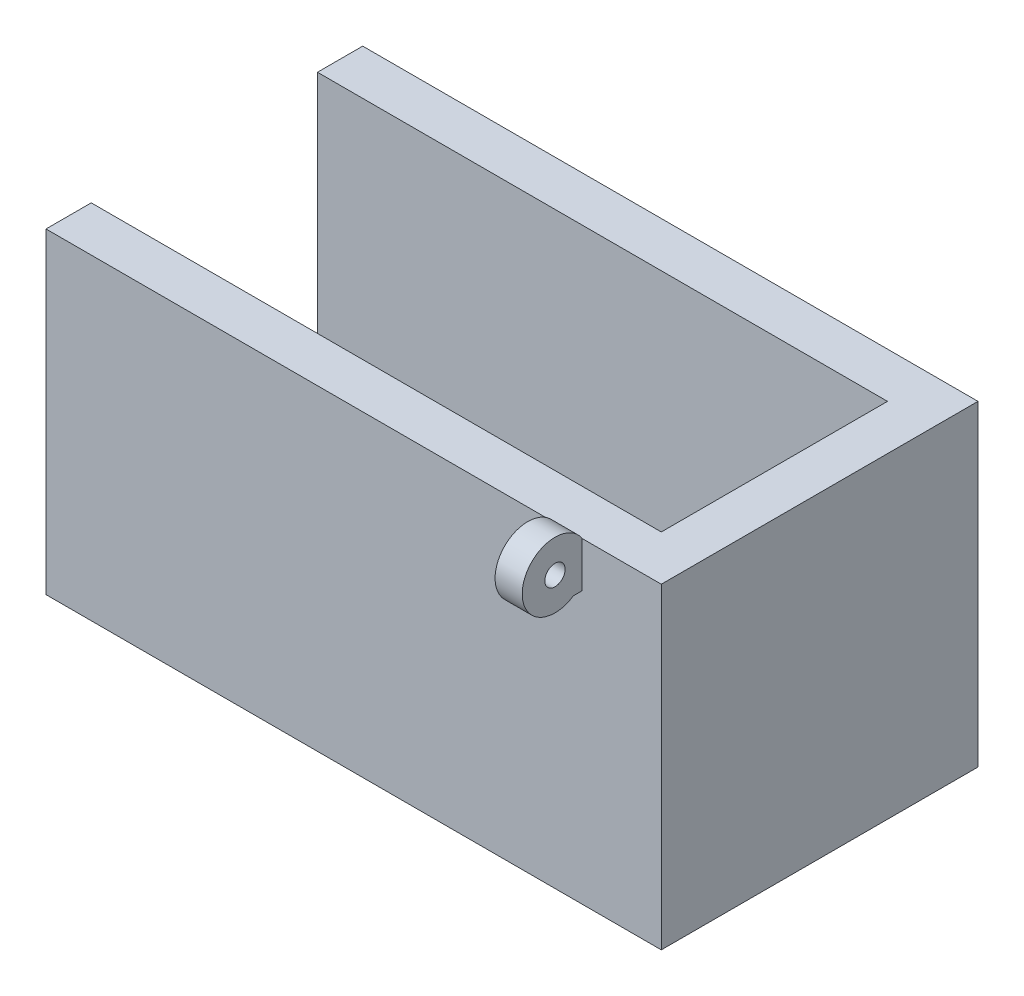
ISO-10303-21;
HEADER;
FILE_DESCRIPTION(('STEP AP214'),'2;1');
FILE_NAME('part.step','',(''),(''),'','','');
FILE_SCHEMA(('AUTOMOTIVE_DESIGN { 1 0 10303 214 1 1 1 1 }'));
ENDSEC;
DATA;
#1=APPLICATION_CONTEXT('core data for automotive mechanical design processes');
#2=APPLICATION_PROTOCOL_DEFINITION('international standard','automotive_design',2000,#1);
#3=PRODUCT_CONTEXT('',#1,'mechanical');
#4=PRODUCT('Part','Part','',(#3));
#5=PRODUCT_RELATED_PRODUCT_CATEGORY('part','',(#4));
#6=PRODUCT_DEFINITION_FORMATION('','',#4);
#7=PRODUCT_DEFINITION_CONTEXT('part definition',#1,'design');
#8=PRODUCT_DEFINITION('design','',#6,#7);
#9=PRODUCT_DEFINITION_SHAPE('','',#8);
#10=(LENGTH_UNIT() NAMED_UNIT(*) SI_UNIT(.MILLI.,.METRE.));
#11=(NAMED_UNIT(*) PLANE_ANGLE_UNIT() SI_UNIT($,.RADIAN.));
#12=(NAMED_UNIT(*) SI_UNIT($,.STERADIAN.) SOLID_ANGLE_UNIT());
#13=UNCERTAINTY_MEASURE_WITH_UNIT(LENGTH_MEASURE(1.E-05),#10,'distance_accuracy_value','');
#14=(GEOMETRIC_REPRESENTATION_CONTEXT(3) GLOBAL_UNCERTAINTY_ASSIGNED_CONTEXT((#13)) GLOBAL_UNIT_ASSIGNED_CONTEXT((#10,
#11,#12)) REPRESENTATION_CONTEXT('',''));
#15=CARTESIAN_POINT('',(0.,0.,0.));
#16=DIRECTION('',(0.,0.,1.));
#17=DIRECTION('',(1.,0.,0.));
#18=AXIS2_PLACEMENT_3D('',#15,#16,#17);
#19=CARTESIAN_POINT('',(-109.463414634146,140.,77.3902439024391));
#20=DIRECTION('',(0.,0.,-1.));
#21=DIRECTION('',(-1.,0.,0.));
#22=AXIS2_PLACEMENT_3D('',#19,#20,#21);
#23=PLANE('',#22);
#24=DIRECTION('',(0.,-1.,0.));
#25=VECTOR('',#24,1.);
#26=CARTESIAN_POINT('',(115.536585365854,132.,77.3902439024391));
#27=LINE('',#26,#25);
#28=CARTESIAN_POINT('',(115.536585365854,140.,77.3902439024391));
#29=VERTEX_POINT('',#28);
#30=CARTESIAN_POINT('',(115.536585365854,120.,77.3902439024391));
#31=VERTEX_POINT('',#30);
#32=EDGE_CURVE('E304',#29,#31,#27,.T.);
#33=ORIENTED_EDGE('',*,*,#32,.F.);
#34=DIRECTION('',(1.,0.,0.));
#35=VECTOR('',#34,1.);
#36=CARTESIAN_POINT('',(-109.463414634146,140.,77.3902439024391));
#37=LINE('',#36,#35);
#38=CARTESIAN_POINT('',(-109.463414634146,140.,77.3902439024391));
#39=VERTEX_POINT('',#38);
#40=EDGE_CURVE('E259',#39,#29,#37,.T.);
#41=ORIENTED_EDGE('',*,*,#40,.F.);
#42=DIRECTION('',(0.,-1.,0.));
#43=VECTOR('',#42,1.);
#44=CARTESIAN_POINT('',(-109.463414634146,140.,77.3902439024391));
#45=LINE('',#44,#43);
#46=CARTESIAN_POINT('',(-109.463414634146,0.,77.3902439024391));
#47=VERTEX_POINT('',#46);
#48=EDGE_CURVE('E12',#39,#47,#45,.T.);
#49=ORIENTED_EDGE('',*,*,#48,.T.);
#50=DIRECTION('',(1.,0.,0.));
#51=VECTOR('',#50,1.);
#52=CARTESIAN_POINT('',(-109.463414634146,0.,77.3902439024391));
#53=LINE('',#52,#51);
#54=CARTESIAN_POINT('',(162.536585365854,0.,77.3902439024391));
#55=VERTEX_POINT('',#54);
#56=EDGE_CURVE('E268',#47,#55,#53,.T.);
#57=ORIENTED_EDGE('',*,*,#56,.T.);
#58=DIRECTION('',(0.,-1.,0.));
#59=VECTOR('',#58,1.);
#60=CARTESIAN_POINT('',(162.536585365854,140.,77.3902439024391));
#61=LINE('',#60,#59);
#62=CARTESIAN_POINT('',(162.536585365854,140.,77.3902439024391));
#63=VERTEX_POINT('',#62);
#64=EDGE_CURVE('E48',#63,#55,#61,.T.);
#65=ORIENTED_EDGE('',*,*,#64,.F.);
#66=CARTESIAN_POINT('',(127.536585365854,140.,77.3902439024391));
#67=VERTEX_POINT('',#66);
#68=EDGE_CURVE('E257',#67,#63,#37,.T.);
#69=ORIENTED_EDGE('',*,*,#68,.F.);
#70=DIRECTION('',(0.,1.,0.));
#71=VECTOR('',#70,1.);
#72=CARTESIAN_POINT('',(127.536585365854,132.,77.3902439024391));
#73=LINE('',#72,#71);
#74=CARTESIAN_POINT('',(127.536585365854,120.,77.3902439024391));
#75=VERTEX_POINT('',#74);
#76=EDGE_CURVE('E177',#75,#67,#73,.T.);
#77=ORIENTED_EDGE('',*,*,#76,.F.);
#78=DIRECTION('',(1.,0.,0.));
#79=VECTOR('',#78,1.);
#80=CARTESIAN_POINT('',(115.536585365854,120.,77.3902439024391));
#81=LINE('',#80,#79);
#82=EDGE_CURVE('E175',#31,#75,#81,.T.);
#83=ORIENTED_EDGE('',*,*,#82,.F.);
#84=EDGE_LOOP('',(#33,#41,#49,#57,#65,#69,#77,#83));
#85=FACE_BOUND('',#84,.T.);
#86=ADVANCED_FACE('F39',(#85),#23,.F.);
#87=CARTESIAN_POINT('',(0.,140.,0.));
#88=DIRECTION('',(0.,1.,0.));
#89=DIRECTION('',(0.,0.,1.));
#90=AXIS2_PLACEMENT_3D('',#87,#88,#89);
#91=PLANE('',#90);
#92=ORIENTED_EDGE('',*,*,#40,.T.);
#93=DIRECTION('',(0.,0.,-1.));
#94=VECTOR('',#93,1.);
#95=CARTESIAN_POINT('',(115.536585365854,140.,0.));
#96=LINE('',#95,#94);
#97=CARTESIAN_POINT('',(115.536585365854,140.,77.3088491154122));
#98=VERTEX_POINT('',#97);
#99=EDGE_CURVE('E55',#29,#98,#96,.T.);
#100=ORIENTED_EDGE('',*,*,#99,.T.);
#101=DIRECTION('',(1.,0.,0.));
#102=VECTOR('',#101,1.);
#103=CARTESIAN_POINT('',(115.536585365854,140.,77.3088491154122));
#104=LINE('',#103,#102);
#105=CARTESIAN_POINT('',(127.536585365854,140.,77.3088491154122));
#106=VERTEX_POINT('',#105);
#107=EDGE_CURVE('E59',#106,#98,#104,.F.);
#108=ORIENTED_EDGE('',*,*,#107,.F.);
#109=DIRECTION('',(0.,0.,-1.));
#110=VECTOR('',#109,1.);
#111=CARTESIAN_POINT('',(127.536585365854,140.,0.));
#112=LINE('',#111,#110);
#113=EDGE_CURVE('E169',#67,#106,#112,.T.);
#114=ORIENTED_EDGE('',*,*,#113,.F.);
#115=ORIENTED_EDGE('',*,*,#68,.T.);
#116=DIRECTION('',(0.,0.,-1.));
#117=VECTOR('',#116,1.);
#118=CARTESIAN_POINT('',(162.536585365854,140.,-62.609756097561));
#119=LINE('',#118,#117);
#120=CARTESIAN_POINT('',(162.536585365854,140.,-62.609756097561));
#121=VERTEX_POINT('',#120);
#122=EDGE_CURVE('E261',#63,#121,#119,.T.);
#123=ORIENTED_EDGE('',*,*,#122,.T.);
#124=DIRECTION('',(-1.,0.,0.));
#125=VECTOR('',#124,1.);
#126=CARTESIAN_POINT('',(-109.463414634146,140.,-62.609756097561));
#127=LINE('',#126,#125);
#128=CARTESIAN_POINT('',(-109.463414634146,140.,-62.609756097561));
#129=VERTEX_POINT('',#128);
#130=EDGE_CURVE('E263',#121,#129,#127,.T.);
#131=ORIENTED_EDGE('',*,*,#130,.T.);
#132=DIRECTION('',(0.,0.,1.));
#133=VECTOR('',#132,1.);
#134=CARTESIAN_POINT('',(-109.463414634146,140.,-62.609756097561));
#135=LINE('',#134,#133);
#136=CARTESIAN_POINT('',(-109.463414634146,140.,-42.609756097561));
#137=VERTEX_POINT('',#136);
#138=EDGE_CURVE('E254',#129,#137,#135,.T.);
#139=ORIENTED_EDGE('',*,*,#138,.T.);
#140=DIRECTION('',(-1.,0.,0.));
#141=VECTOR('',#140,1.);
#142=CARTESIAN_POINT('',(-109.463414634146,140.,-42.609756097561));
#143=LINE('',#142,#141);
#144=CARTESIAN_POINT('',(142.536585365854,140.,-42.609756097561));
#145=VERTEX_POINT('',#144);
#146=EDGE_CURVE('E229',#145,#137,#143,.T.);
#147=ORIENTED_EDGE('',*,*,#146,.F.);
#148=DIRECTION('',(0.,0.,-1.));
#149=VECTOR('',#148,1.);
#150=CARTESIAN_POINT('',(142.536585365854,140.,-42.609756097561));
#151=LINE('',#150,#149);
#152=CARTESIAN_POINT('',(142.536585365854,140.,57.390243902439));
#153=VERTEX_POINT('',#152);
#154=EDGE_CURVE('E241',#153,#145,#151,.T.);
#155=ORIENTED_EDGE('',*,*,#154,.F.);
#156=DIRECTION('',(1.,0.,0.));
#157=VECTOR('',#156,1.);
#158=CARTESIAN_POINT('',(-109.463414634146,140.,57.390243902439));
#159=LINE('',#158,#157);
#160=CARTESIAN_POINT('',(-109.463414634146,140.,57.390243902439));
#161=VERTEX_POINT('',#160);
#162=EDGE_CURVE('E218',#161,#153,#159,.T.);
#163=ORIENTED_EDGE('',*,*,#162,.F.);
#164=EDGE_CURVE('E258',#161,#39,#135,.T.);
#165=ORIENTED_EDGE('',*,*,#164,.T.);
#166=EDGE_LOOP('',(#92,#100,#108,#114,#115,#123,#131,#139,#147,#155,#163,#165));
#167=FACE_BOUND('',#166,.T.);
#168=ADVANCED_FACE('F301',(#167),#91,.T.);
#169=CARTESIAN_POINT('',(-109.463414634146,140.,-62.609756097561));
#170=DIRECTION('',(1.,0.,0.));
#171=DIRECTION('',(0.,0.,-1.));
#172=AXIS2_PLACEMENT_3D('',#169,#170,#171);
#173=PLANE('',#172);
#174=DIRECTION('',(0.,0.,1.));
#175=VECTOR('',#174,1.);
#176=CARTESIAN_POINT('',(-109.463414634146,7.,-42.609756097561));
#177=LINE('',#176,#175);
#178=CARTESIAN_POINT('',(-109.463414634146,7.00000000000001,-42.609756097561));
#179=VERTEX_POINT('',#178);
#180=CARTESIAN_POINT('',(-109.463414634146,7.,57.390243902439));
#181=VERTEX_POINT('',#180);
#182=EDGE_CURVE('E208',#179,#181,#177,.T.);
#183=ORIENTED_EDGE('',*,*,#182,.F.);
#184=DIRECTION('',(0.,-1.,0.));
#185=VECTOR('',#184,1.);
#186=CARTESIAN_POINT('',(-109.463414634146,20.,-42.609756097561));
#187=LINE('',#186,#185);
#188=CARTESIAN_POINT('',(-109.463414634146,20.,-42.609756097561));
#189=VERTEX_POINT('',#188);
#190=EDGE_CURVE('E192',#189,#179,#187,.T.);
#191=ORIENTED_EDGE('',*,*,#190,.F.);
#192=DIRECTION('',(0.,0.,-1.));
#193=VECTOR('',#192,1.);
#194=CARTESIAN_POINT('',(-109.463414634146,20.,-42.609756097561));
#195=LINE('',#194,#193);
#196=CARTESIAN_POINT('',(-109.463414634146,20.,57.390243902439));
#197=VERTEX_POINT('',#196);
#198=EDGE_CURVE('E197',#197,#189,#195,.T.);
#199=ORIENTED_EDGE('',*,*,#198,.F.);
#200=DIRECTION('',(0.,1.,0.));
#201=VECTOR('',#200,1.);
#202=CARTESIAN_POINT('',(-109.463414634146,20.,57.390243902439));
#203=LINE('',#202,#201);
#204=EDGE_CURVE('E211',#181,#197,#203,.T.);
#205=ORIENTED_EDGE('',*,*,#204,.F.);
#206=EDGE_LOOP('',(#183,#191,#199,#205));
#207=FACE_BOUND('',#206,.T.);
#208=DIRECTION('',(0.,0.,1.));
#209=VECTOR('',#208,1.);
#210=CARTESIAN_POINT('',(-109.463414634146,30.,-42.609756097561));
#211=LINE('',#210,#209);
#212=CARTESIAN_POINT('',(-109.463414634146,30.,-42.609756097561));
#213=VERTEX_POINT('',#212);
#214=CARTESIAN_POINT('',(-109.463414634146,30.,57.390243902439));
#215=VERTEX_POINT('',#214);
#216=EDGE_CURVE('E225',#213,#215,#211,.T.);
#217=ORIENTED_EDGE('',*,*,#216,.F.);
#218=DIRECTION('',(0.,1.,0.));
#219=VECTOR('',#218,1.);
#220=CARTESIAN_POINT('',(-109.463414634146,30.,-42.609756097561));
#221=LINE('',#220,#219);
#222=EDGE_CURVE('E245',#213,#137,#221,.T.);
#223=ORIENTED_EDGE('',*,*,#222,.T.);
#224=ORIENTED_EDGE('',*,*,#138,.F.);
#225=DIRECTION('',(0.,-1.,0.));
#226=VECTOR('',#225,1.);
#227=CARTESIAN_POINT('',(-109.463414634146,140.,-62.609756097561));
#228=LINE('',#227,#226);
#229=CARTESIAN_POINT('',(-109.463414634146,0.,-62.609756097561));
#230=VERTEX_POINT('',#229);
#231=EDGE_CURVE('E265',#129,#230,#228,.T.);
#232=ORIENTED_EDGE('',*,*,#231,.T.);
#233=DIRECTION('',(0.,0.,1.));
#234=VECTOR('',#233,1.);
#235=CARTESIAN_POINT('',(-109.463414634146,0.,-62.609756097561));
#236=LINE('',#235,#234);
#237=EDGE_CURVE('E248',#230,#47,#236,.T.);
#238=ORIENTED_EDGE('',*,*,#237,.T.);
#239=ORIENTED_EDGE('',*,*,#48,.F.);
#240=ORIENTED_EDGE('',*,*,#164,.F.);
#241=DIRECTION('',(0.,1.,0.));
#242=VECTOR('',#241,1.);
#243=CARTESIAN_POINT('',(-109.463414634146,30.,57.390243902439));
#244=LINE('',#243,#242);
#245=EDGE_CURVE('E238',#215,#161,#244,.T.);
#246=ORIENTED_EDGE('',*,*,#245,.F.);
#247=EDGE_LOOP('',(#217,#223,#224,#232,#238,#239,#240,#246));
#248=FACE_BOUND('',#247,.T.);
#249=ADVANCED_FACE('F41',(#207,#248),#173,.F.);
#250=CARTESIAN_POINT('',(162.536585365854,140.,-62.609756097561));
#251=DIRECTION('',(-1.,0.,0.));
#252=DIRECTION('',(0.,0.,1.));
#253=AXIS2_PLACEMENT_3D('',#250,#251,#252);
#254=PLANE('',#253);
#255=DIRECTION('',(0.,0.,-1.));
#256=VECTOR('',#255,1.);
#257=CARTESIAN_POINT('',(162.536585365854,0.,-62.609756097561));
#258=LINE('',#257,#256);
#259=CARTESIAN_POINT('',(162.536585365854,0.,-62.609756097561));
#260=VERTEX_POINT('',#259);
#261=EDGE_CURVE('E270',#55,#260,#258,.T.);
#262=ORIENTED_EDGE('',*,*,#261,.T.);
#263=DIRECTION('',(0.,-1.,0.));
#264=VECTOR('',#263,1.);
#265=CARTESIAN_POINT('',(162.536585365854,140.,-62.609756097561));
#266=LINE('',#265,#264);
#267=EDGE_CURVE('E276',#121,#260,#266,.T.);
#268=ORIENTED_EDGE('',*,*,#267,.F.);
#269=ORIENTED_EDGE('',*,*,#122,.F.);
#270=ORIENTED_EDGE('',*,*,#64,.T.);
#271=EDGE_LOOP('',(#262,#268,#269,#270));
#272=FACE_BOUND('',#271,.T.);
#273=ADVANCED_FACE('F284',(#272),#254,.F.);
#274=CARTESIAN_POINT('',(-109.463414634146,140.,-62.609756097561));
#275=DIRECTION('',(0.,0.,1.));
#276=DIRECTION('',(1.,0.,0.));
#277=AXIS2_PLACEMENT_3D('',#274,#275,#276);
#278=PLANE('',#277);
#279=DIRECTION('',(-1.,0.,0.));
#280=VECTOR('',#279,1.);
#281=CARTESIAN_POINT('',(-109.463414634146,0.,-62.609756097561));
#282=LINE('',#281,#280);
#283=EDGE_CURVE('E272',#260,#230,#282,.T.);
#284=ORIENTED_EDGE('',*,*,#283,.T.);
#285=ORIENTED_EDGE('',*,*,#231,.F.);
#286=ORIENTED_EDGE('',*,*,#130,.F.);
#287=ORIENTED_EDGE('',*,*,#267,.T.);
#288=EDGE_LOOP('',(#284,#285,#286,#287));
#289=FACE_BOUND('',#288,.T.);
#290=ADVANCED_FACE('F294',(#289),#278,.F.);
#291=CARTESIAN_POINT('',(0.,0.,0.));
#292=DIRECTION('',(0.,1.,0.));
#293=DIRECTION('',(0.,0.,1.));
#294=AXIS2_PLACEMENT_3D('',#291,#292,#293);
#295=PLANE('',#294);
#296=CARTESIAN_POINT('',(-89.4634146341463,0.,7.39024390243905));
#297=DIRECTION('',(0.,1.,0.));
#298=DIRECTION('',(0.,0.,1.));
#299=AXIS2_PLACEMENT_3D('',#296,#297,#298);
#300=CIRCLE('',#299,3.00000000000001);
#301=CARTESIAN_POINT('',(-89.4634146341463,0.,10.3902439024391));
#302=VERTEX_POINT('',#301);
#303=EDGE_CURVE('E184',#302,#302,#300,.T.);
#304=ORIENTED_EDGE('',*,*,#303,.T.);
#305=EDGE_LOOP('',(#304));
#306=FACE_BOUND('',#305,.T.);
#307=ORIENTED_EDGE('',*,*,#237,.F.);
#308=ORIENTED_EDGE('',*,*,#283,.F.);
#309=ORIENTED_EDGE('',*,*,#261,.F.);
#310=ORIENTED_EDGE('',*,*,#56,.F.);
#311=EDGE_LOOP('',(#307,#308,#309,#310));
#312=FACE_BOUND('',#311,.T.);
#313=ADVANCED_FACE('F291',(#306,#312),#295,.F.);
#314=CARTESIAN_POINT('',(-109.463414634146,30.,-42.609756097561));
#315=DIRECTION('',(0.,0.,-1.));
#316=DIRECTION('',(-1.,0.,0.));
#317=AXIS2_PLACEMENT_3D('',#314,#315,#316);
#318=PLANE('',#317);
#319=ORIENTED_EDGE('',*,*,#146,.T.);
#320=ORIENTED_EDGE('',*,*,#222,.F.);
#321=DIRECTION('',(-1.,0.,0.));
#322=VECTOR('',#321,1.);
#323=CARTESIAN_POINT('',(-109.463414634146,30.,-42.609756097561));
#324=LINE('',#323,#322);
#325=CARTESIAN_POINT('',(142.536585365854,30.,-42.609756097561));
#326=VERTEX_POINT('',#325);
#327=EDGE_CURVE('E235',#326,#213,#324,.T.);
#328=ORIENTED_EDGE('',*,*,#327,.F.);
#329=DIRECTION('',(0.,1.,0.));
#330=VECTOR('',#329,1.);
#331=CARTESIAN_POINT('',(142.536585365854,30.,-42.609756097561));
#332=LINE('',#331,#330);
#333=EDGE_CURVE('E249',#326,#145,#332,.T.);
#334=ORIENTED_EDGE('',*,*,#333,.T.);
#335=EDGE_LOOP('',(#319,#320,#328,#334));
#336=FACE_BOUND('',#335,.T.);
#337=ADVANCED_FACE('F340',(#336),#318,.F.);
#338=CARTESIAN_POINT('',(142.536585365854,30.,-42.609756097561));
#339=DIRECTION('',(1.,0.,0.));
#340=DIRECTION('',(0.,0.,-1.));
#341=AXIS2_PLACEMENT_3D('',#338,#339,#340);
#342=PLANE('',#341);
#343=ORIENTED_EDGE('',*,*,#154,.T.);
#344=ORIENTED_EDGE('',*,*,#333,.F.);
#345=DIRECTION('',(0.,0.,-1.));
#346=VECTOR('',#345,1.);
#347=CARTESIAN_POINT('',(142.536585365854,30.,-42.609756097561));
#348=LINE('',#347,#346);
#349=CARTESIAN_POINT('',(142.536585365854,30.,57.390243902439));
#350=VERTEX_POINT('',#349);
#351=EDGE_CURVE('E232',#350,#326,#348,.T.);
#352=ORIENTED_EDGE('',*,*,#351,.F.);
#353=DIRECTION('',(0.,1.,0.));
#354=VECTOR('',#353,1.);
#355=CARTESIAN_POINT('',(142.536585365854,30.,57.390243902439));
#356=LINE('',#355,#354);
#357=EDGE_CURVE('E251',#350,#153,#356,.T.);
#358=ORIENTED_EDGE('',*,*,#357,.T.);
#359=EDGE_LOOP('',(#343,#344,#352,#358));
#360=FACE_BOUND('',#359,.T.);
#361=ADVANCED_FACE('F347',(#360),#342,.F.);
#362=CARTESIAN_POINT('',(-109.463414634146,30.,57.390243902439));
#363=DIRECTION('',(0.,0.,1.));
#364=DIRECTION('',(1.,0.,0.));
#365=AXIS2_PLACEMENT_3D('',#362,#363,#364);
#366=PLANE('',#365);
#367=ORIENTED_EDGE('',*,*,#162,.T.);
#368=ORIENTED_EDGE('',*,*,#357,.F.);
#369=DIRECTION('',(1.,0.,0.));
#370=VECTOR('',#369,1.);
#371=CARTESIAN_POINT('',(-109.463414634146,30.,57.390243902439));
#372=LINE('',#371,#370);
#373=EDGE_CURVE('E228',#215,#350,#372,.T.);
#374=ORIENTED_EDGE('',*,*,#373,.F.);
#375=ORIENTED_EDGE('',*,*,#245,.T.);
#376=EDGE_LOOP('',(#367,#368,#374,#375));
#377=FACE_BOUND('',#376,.T.);
#378=ADVANCED_FACE('F343',(#377),#366,.F.);
#379=CARTESIAN_POINT('',(0.,30.,0.));
#380=DIRECTION('',(0.,1.,0.));
#381=DIRECTION('',(0.,0.,1.));
#382=AXIS2_PLACEMENT_3D('',#379,#380,#381);
#383=PLANE('',#382);
#384=CARTESIAN_POINT('',(-89.4634146341463,30.,7.39024390243905));
#385=DIRECTION('',(0.,1.,0.));
#386=DIRECTION('',(0.,0.,1.));
#387=AXIS2_PLACEMENT_3D('',#384,#385,#386);
#388=CIRCLE('',#387,3.00000000000001);
#389=CARTESIAN_POINT('',(-89.4634146341463,30.,10.3902439024391));
#390=VERTEX_POINT('',#389);
#391=EDGE_CURVE('E179',#390,#390,#388,.T.);
#392=ORIENTED_EDGE('',*,*,#391,.F.);
#393=EDGE_LOOP('',(#392));
#394=FACE_BOUND('',#393,.T.);
#395=ORIENTED_EDGE('',*,*,#216,.T.);
#396=ORIENTED_EDGE('',*,*,#373,.T.);
#397=ORIENTED_EDGE('',*,*,#351,.T.);
#398=ORIENTED_EDGE('',*,*,#327,.T.);
#399=EDGE_LOOP('',(#395,#396,#397,#398));
#400=FACE_BOUND('',#399,.T.);
#401=ADVANCED_FACE('F346',(#394,#400),#383,.T.);
#402=CARTESIAN_POINT('',(-9.46341463414631,20.,-42.609756097561));
#403=DIRECTION('',(0.,0.,-1.));
#404=DIRECTION('',(-1.,0.,0.));
#405=AXIS2_PLACEMENT_3D('',#402,#403,#404);
#406=PLANE('',#405);
#407=ORIENTED_EDGE('',*,*,#190,.T.);
#408=DIRECTION('',(-1.,0.,0.));
#409=VECTOR('',#408,1.);
#410=CARTESIAN_POINT('',(-9.46341463414631,7.,-42.609756097561));
#411=LINE('',#410,#409);
#412=CARTESIAN_POINT('',(-9.46341463414631,7.,-42.609756097561));
#413=VERTEX_POINT('',#412);
#414=EDGE_CURVE('E206',#413,#179,#411,.T.);
#415=ORIENTED_EDGE('',*,*,#414,.F.);
#416=DIRECTION('',(0.,-1.,0.));
#417=VECTOR('',#416,1.);
#418=CARTESIAN_POINT('',(-9.46341463414631,20.,-42.609756097561));
#419=LINE('',#418,#417);
#420=CARTESIAN_POINT('',(-9.46341463414631,20.,-42.609756097561));
#421=VERTEX_POINT('',#420);
#422=EDGE_CURVE('E193',#421,#413,#419,.T.);
#423=ORIENTED_EDGE('',*,*,#422,.F.);
#424=DIRECTION('',(-1.,0.,0.));
#425=VECTOR('',#424,1.);
#426=CARTESIAN_POINT('',(-9.46341463414631,20.,-42.609756097561));
#427=LINE('',#426,#425);
#428=EDGE_CURVE('E216',#421,#189,#427,.T.);
#429=ORIENTED_EDGE('',*,*,#428,.T.);
#430=EDGE_LOOP('',(#407,#415,#423,#429));
#431=FACE_BOUND('',#430,.T.);
#432=ADVANCED_FACE('F357',(#431),#406,.F.);
#433=CARTESIAN_POINT('',(-9.46341463414631,20.,-42.609756097561));
#434=DIRECTION('',(0.,1.,0.));
#435=DIRECTION('',(0.,0.,1.));
#436=AXIS2_PLACEMENT_3D('',#433,#434,#435);
#437=PLANE('',#436);
#438=CARTESIAN_POINT('',(-89.4634146341463,20.,7.39024390243905));
#439=DIRECTION('',(0.,1.,0.));
#440=DIRECTION('',(0.,0.,1.));
#441=AXIS2_PLACEMENT_3D('',#438,#439,#440);
#442=CIRCLE('',#441,3.00000000000001);
#443=CARTESIAN_POINT('',(-89.4634146341463,20.,10.3902439024391));
#444=VERTEX_POINT('',#443);
#445=EDGE_CURVE('E189',#444,#444,#442,.T.);
#446=ORIENTED_EDGE('',*,*,#445,.T.);
#447=EDGE_LOOP('',(#446));
#448=FACE_BOUND('',#447,.T.);
#449=ORIENTED_EDGE('',*,*,#198,.T.);
#450=ORIENTED_EDGE('',*,*,#428,.F.);
#451=DIRECTION('',(0.,0.,-1.));
#452=VECTOR('',#451,1.);
#453=CARTESIAN_POINT('',(-9.46341463414631,20.,-42.609756097561));
#454=LINE('',#453,#452);
#455=CARTESIAN_POINT('',(-9.46341463414628,20.,57.390243902439));
#456=VERTEX_POINT('',#455);
#457=EDGE_CURVE('E203',#456,#421,#454,.T.);
#458=ORIENTED_EDGE('',*,*,#457,.F.);
#459=DIRECTION('',(-1.,0.,0.));
#460=VECTOR('',#459,1.);
#461=CARTESIAN_POINT('',(-9.46341463414628,20.,57.390243902439));
#462=LINE('',#461,#460);
#463=EDGE_CURVE('E219',#456,#197,#462,.T.);
#464=ORIENTED_EDGE('',*,*,#463,.T.);
#465=EDGE_LOOP('',(#449,#450,#458,#464));
#466=FACE_BOUND('',#465,.T.);
#467=ADVANCED_FACE('F361',(#448,#466),#437,.F.);
#468=CARTESIAN_POINT('',(-9.46341463414628,20.,57.390243902439));
#469=DIRECTION('',(0.,0.,1.));
#470=DIRECTION('',(1.,0.,0.));
#471=AXIS2_PLACEMENT_3D('',#468,#469,#470);
#472=PLANE('',#471);
#473=ORIENTED_EDGE('',*,*,#204,.T.);
#474=ORIENTED_EDGE('',*,*,#463,.F.);
#475=DIRECTION('',(0.,1.,0.));
#476=VECTOR('',#475,1.);
#477=CARTESIAN_POINT('',(-9.46341463414628,20.,57.390243902439));
#478=LINE('',#477,#476);
#479=CARTESIAN_POINT('',(-9.46341463414628,7.,57.390243902439));
#480=VERTEX_POINT('',#479);
#481=EDGE_CURVE('E200',#480,#456,#478,.T.);
#482=ORIENTED_EDGE('',*,*,#481,.F.);
#483=DIRECTION('',(-1.,0.,0.));
#484=VECTOR('',#483,1.);
#485=CARTESIAN_POINT('',(-9.46341463414628,7.,57.390243902439));
#486=LINE('',#485,#484);
#487=EDGE_CURVE('E221',#480,#181,#486,.T.);
#488=ORIENTED_EDGE('',*,*,#487,.T.);
#489=EDGE_LOOP('',(#473,#474,#482,#488));
#490=FACE_BOUND('',#489,.T.);
#491=ADVANCED_FACE('F367',(#490),#472,.F.);
#492=CARTESIAN_POINT('',(-9.46341463414631,7.,-42.609756097561));
#493=DIRECTION('',(0.,-1.,0.));
#494=DIRECTION('',(0.,0.,-1.));
#495=AXIS2_PLACEMENT_3D('',#492,#493,#494);
#496=PLANE('',#495);
#497=CARTESIAN_POINT('',(-89.4634146341463,7.,7.39024390243905));
#498=DIRECTION('',(0.,-1.,0.));
#499=DIRECTION('',(0.,0.,-1.));
#500=AXIS2_PLACEMENT_3D('',#497,#498,#499);
#501=CIRCLE('',#500,3.00000000000001);
#502=CARTESIAN_POINT('',(-89.4634146341463,7.,4.39024390243904));
#503=VERTEX_POINT('',#502);
#504=EDGE_CURVE('E43',#503,#503,#501,.T.);
#505=ORIENTED_EDGE('',*,*,#504,.T.);
#506=EDGE_LOOP('',(#505));
#507=FACE_BOUND('',#506,.T.);
#508=ORIENTED_EDGE('',*,*,#182,.T.);
#509=ORIENTED_EDGE('',*,*,#487,.F.);
#510=DIRECTION('',(0.,0.,1.));
#511=VECTOR('',#510,1.);
#512=CARTESIAN_POINT('',(-9.46341463414631,7.,-42.609756097561));
#513=LINE('',#512,#511);
#514=EDGE_CURVE('E196',#413,#480,#513,.T.);
#515=ORIENTED_EDGE('',*,*,#514,.F.);
#516=ORIENTED_EDGE('',*,*,#414,.T.);
#517=EDGE_LOOP('',(#508,#509,#515,#516));
#518=FACE_BOUND('',#517,.T.);
#519=ADVANCED_FACE('F363',(#507,#518),#496,.F.);
#520=CARTESIAN_POINT('',(-9.46341463414629,0.,0.));
#521=DIRECTION('',(-1.,0.,0.));
#522=DIRECTION('',(0.,0.,1.));
#523=AXIS2_PLACEMENT_3D('',#520,#521,#522);
#524=PLANE('',#523);
#525=ORIENTED_EDGE('',*,*,#422,.T.);
#526=ORIENTED_EDGE('',*,*,#514,.T.);
#527=ORIENTED_EDGE('',*,*,#481,.T.);
#528=ORIENTED_EDGE('',*,*,#457,.T.);
#529=EDGE_LOOP('',(#525,#526,#527,#528));
#530=FACE_BOUND('',#529,.T.);
#531=ADVANCED_FACE('F366',(#530),#524,.T.);
#532=CARTESIAN_POINT('',(-89.4634146341463,0.,7.39024390243905));
#533=DIRECTION('',(0.,1.,0.));
#534=DIRECTION('',(0.,0.,1.));
#535=AXIS2_PLACEMENT_3D('',#532,#533,#534);
#536=CYLINDRICAL_SURFACE('',#535,3.00000000000001);
#537=ORIENTED_EDGE('',*,*,#303,.F.);
#538=EDGE_LOOP('',(#537));
#539=FACE_BOUND('',#538,.T.);
#540=ORIENTED_EDGE('',*,*,#504,.F.);
#541=EDGE_LOOP('',(#540));
#542=FACE_BOUND('',#541,.T.);
#543=ADVANCED_FACE('F377',(#539,#542),#536,.F.);
#544=ORIENTED_EDGE('',*,*,#391,.T.);
#545=EDGE_LOOP('',(#544));
#546=FACE_BOUND('',#545,.T.);
#547=ORIENTED_EDGE('',*,*,#445,.F.);
#548=EDGE_LOOP('',(#547));
#549=FACE_BOUND('',#548,.T.);
#550=ADVANCED_FACE('F379',(#546,#549),#536,.F.);
#551=CARTESIAN_POINT('',(115.536585365854,132.,87.3902439024391));
#552=DIRECTION('',(1.,0.,0.));
#553=DIRECTION('',(0.,0.,-1.));
#554=AXIS2_PLACEMENT_3D('',#551,#552,#553);
#555=PLANE('',#554);
#556=DIRECTION('',(0.,0.,-1.));
#557=VECTOR('',#556,1.);
#558=CARTESIAN_POINT('',(115.536585365854,120.,87.3902439024391));
#559=LINE('',#558,#557);
#560=CARTESIAN_POINT('',(115.536585365854,120.,81.2686615443022));
#561=VERTEX_POINT('',#560);
#562=EDGE_CURVE('E176',#561,#31,#559,.T.);
#563=ORIENTED_EDGE('',*,*,#562,.F.);
#564=CARTESIAN_POINT('',(115.536585365854,132.,89.3902439024391));
#565=DIRECTION('',(1.,0.,0.));
#566=DIRECTION('',(0.,0.,-1.));
#567=AXIS2_PLACEMENT_3D('',#564,#565,#566);
#568=CIRCLE('',#567,14.49);
#569=EDGE_CURVE('E158',#98,#561,#568,.T.);
#570=ORIENTED_EDGE('',*,*,#569,.F.);
#571=ORIENTED_EDGE('',*,*,#99,.F.);
#572=ORIENTED_EDGE('',*,*,#32,.T.);
#573=EDGE_LOOP('',(#563,#570,#571,#572));
#574=FACE_BOUND('',#573,.T.);
#575=CARTESIAN_POINT('',(115.536585365854,132.,89.3902439024391));
#576=DIRECTION('',(1.,0.,0.));
#577=DIRECTION('',(0.,0.,-1.));
#578=AXIS2_PLACEMENT_3D('',#575,#576,#577);
#579=CIRCLE('',#578,4.48999999999999);
#580=CARTESIAN_POINT('',(115.536585365854,132.,84.9002439024391));
#581=VERTEX_POINT('',#580);
#582=EDGE_CURVE('E170',#581,#581,#579,.T.);
#583=ORIENTED_EDGE('',*,*,#582,.T.);
#584=EDGE_LOOP('',(#583));
#585=FACE_BOUND('',#584,.T.);
#586=ADVANCED_FACE('F317',(#574,#585),#555,.F.);
#587=CARTESIAN_POINT('',(115.536585365854,120.,87.3902439024391));
#588=DIRECTION('',(0.,1.,0.));
#589=DIRECTION('',(0.,0.,1.));
#590=AXIS2_PLACEMENT_3D('',#587,#588,#589);
#591=PLANE('',#590);
#592=DIRECTION('',(0.,0.,-1.));
#593=VECTOR('',#592,1.);
#594=CARTESIAN_POINT('',(127.536585365854,120.,87.3902439024391));
#595=LINE('',#594,#593);
#596=CARTESIAN_POINT('',(127.536585365854,120.,81.2686615443022));
#597=VERTEX_POINT('',#596);
#598=EDGE_CURVE('E167',#597,#75,#595,.T.);
#599=ORIENTED_EDGE('',*,*,#598,.F.);
#600=DIRECTION('',(1.,0.,0.));
#601=VECTOR('',#600,1.);
#602=CARTESIAN_POINT('',(115.536585365854,120.,81.2686615443022));
#603=LINE('',#602,#601);
#604=EDGE_CURVE('E153',#597,#561,#603,.F.);
#605=ORIENTED_EDGE('',*,*,#604,.T.);
#606=ORIENTED_EDGE('',*,*,#562,.T.);
#607=ORIENTED_EDGE('',*,*,#82,.T.);
#608=EDGE_LOOP('',(#599,#605,#606,#607));
#609=FACE_BOUND('',#608,.T.);
#610=ADVANCED_FACE('F173',(#609),#591,.F.);
#611=CARTESIAN_POINT('',(127.536585365854,132.,87.3902439024391));
#612=DIRECTION('',(-1.,0.,0.));
#613=DIRECTION('',(0.,0.,1.));
#614=AXIS2_PLACEMENT_3D('',#611,#612,#613);
#615=PLANE('',#614);
#616=CARTESIAN_POINT('',(127.536585365854,132.,89.3902439024391));
#617=DIRECTION('',(1.,0.,0.));
#618=DIRECTION('',(0.,0.,-1.));
#619=AXIS2_PLACEMENT_3D('',#616,#617,#618);
#620=CIRCLE('',#619,14.49);
#621=EDGE_CURVE('E156',#106,#597,#620,.T.);
#622=ORIENTED_EDGE('',*,*,#621,.T.);
#623=ORIENTED_EDGE('',*,*,#598,.T.);
#624=ORIENTED_EDGE('',*,*,#76,.T.);
#625=ORIENTED_EDGE('',*,*,#113,.T.);
#626=EDGE_LOOP('',(#622,#623,#624,#625));
#627=FACE_BOUND('',#626,.T.);
#628=CARTESIAN_POINT('',(127.536585365854,132.,89.3902439024391));
#629=DIRECTION('',(1.,0.,0.));
#630=DIRECTION('',(0.,0.,-1.));
#631=AXIS2_PLACEMENT_3D('',#628,#629,#630);
#632=CIRCLE('',#631,4.48999999999999);
#633=CARTESIAN_POINT('',(127.536585365854,132.,84.9002439024391));
#634=VERTEX_POINT('',#633);
#635=EDGE_CURVE('E311',#634,#634,#632,.T.);
#636=ORIENTED_EDGE('',*,*,#635,.F.);
#637=EDGE_LOOP('',(#636));
#638=FACE_BOUND('',#637,.T.);
#639=ADVANCED_FACE('F165',(#627,#638),#615,.F.);
#640=CARTESIAN_POINT('',(115.536585365854,132.,89.3902439024391));
#641=DIRECTION('',(1.,0.,0.));
#642=DIRECTION('',(0.,0.,-1.));
#643=AXIS2_PLACEMENT_3D('',#640,#641,#642);
#644=CYLINDRICAL_SURFACE('',#643,4.48999999999999);
#645=ORIENTED_EDGE('',*,*,#635,.T.);
#646=EDGE_LOOP('',(#645));
#647=FACE_BOUND('',#646,.T.);
#648=ORIENTED_EDGE('',*,*,#582,.F.);
#649=EDGE_LOOP('',(#648));
#650=FACE_BOUND('',#649,.T.);
#651=ADVANCED_FACE('F319',(#647,#650),#644,.F.);
#652=CARTESIAN_POINT('',(115.536585365854,132.,89.3902439024391));
#653=DIRECTION('',(1.,0.,0.));
#654=DIRECTION('',(0.,0.,-1.));
#655=AXIS2_PLACEMENT_3D('',#652,#653,#654);
#656=CYLINDRICAL_SURFACE('',#655,14.49);
#657=ORIENTED_EDGE('',*,*,#621,.F.);
#658=ORIENTED_EDGE('',*,*,#107,.T.);
#659=ORIENTED_EDGE('',*,*,#569,.T.);
#660=ORIENTED_EDGE('',*,*,#604,.F.);
#661=EDGE_LOOP('',(#657,#658,#659,#660));
#662=FACE_BOUND('',#661,.T.);
#663=ADVANCED_FACE('F155',(#662),#656,.T.);
#664=CLOSED_SHELL('',(#86,#168,#249,#273,#290,#313,#337,#361,#378,#401,#432,#467,#491,#519,#531,
#543,#550,#586,#610,#639,#651,#663));
#665=MANIFOLD_SOLID_BREP('B2',#664);
#666=ADVANCED_BREP_SHAPE_REPRESENTATION('',(#18,#665),#14);
#667=SHAPE_DEFINITION_REPRESENTATION(#9,#666);
ENDSEC;
END-ISO-10303-21;
